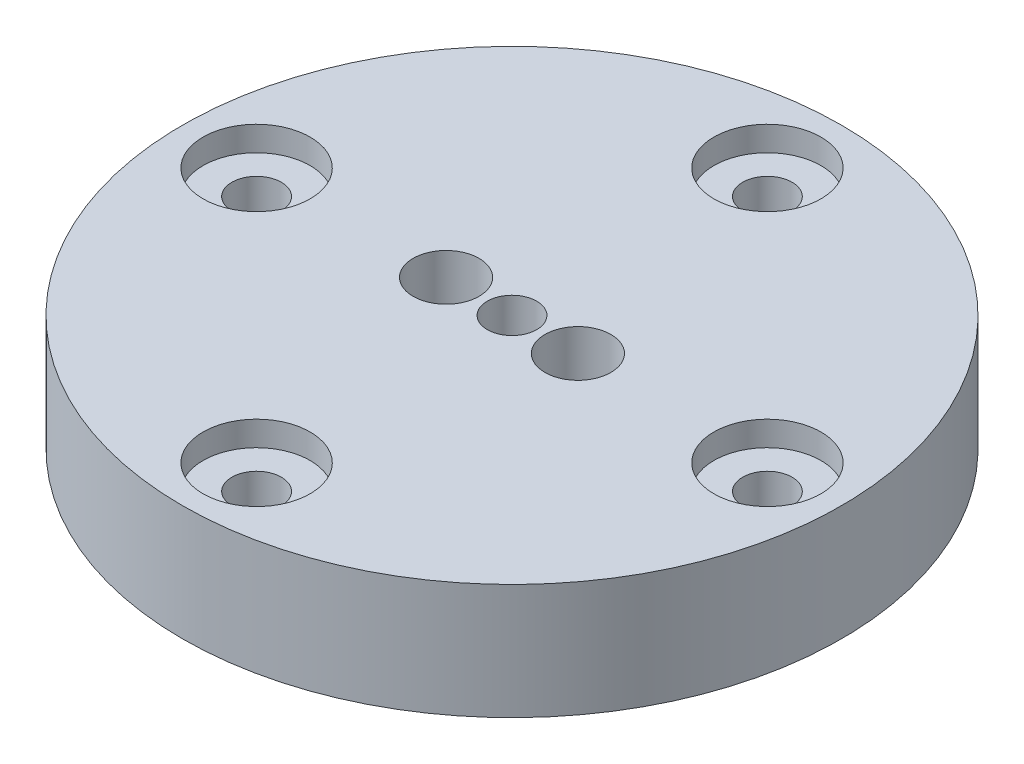
ISO-10303-21;
HEADER;
FILE_DESCRIPTION(('STEP AP214'),'2;1');
FILE_NAME('part.step','',(''),(''),'','','');
FILE_SCHEMA(('AUTOMOTIVE_DESIGN { 1 0 10303 214 1 1 1 1 }'));
ENDSEC;
DATA;
#1=APPLICATION_CONTEXT('core data for automotive mechanical design processes');
#2=APPLICATION_PROTOCOL_DEFINITION('international standard','automotive_design',2000,#1);
#3=PRODUCT_CONTEXT('',#1,'mechanical');
#4=PRODUCT('Part','Part','',(#3));
#5=PRODUCT_RELATED_PRODUCT_CATEGORY('part','',(#4));
#6=PRODUCT_DEFINITION_FORMATION('','',#4);
#7=PRODUCT_DEFINITION_CONTEXT('part definition',#1,'design');
#8=PRODUCT_DEFINITION('design','',#6,#7);
#9=PRODUCT_DEFINITION_SHAPE('','',#8);
#10=(LENGTH_UNIT() NAMED_UNIT(*) SI_UNIT(.MILLI.,.METRE.));
#11=(NAMED_UNIT(*) PLANE_ANGLE_UNIT() SI_UNIT($,.RADIAN.));
#12=(NAMED_UNIT(*) SI_UNIT($,.STERADIAN.) SOLID_ANGLE_UNIT());
#13=UNCERTAINTY_MEASURE_WITH_UNIT(LENGTH_MEASURE(1.E-05),#10,'distance_accuracy_value','');
#14=(GEOMETRIC_REPRESENTATION_CONTEXT(3) GLOBAL_UNCERTAINTY_ASSIGNED_CONTEXT((#13)) GLOBAL_UNIT_ASSIGNED_CONTEXT((#10,
#11,#12)) REPRESENTATION_CONTEXT('',''));
#15=CARTESIAN_POINT('',(0.,0.,0.));
#16=DIRECTION('',(0.,0.,1.));
#17=DIRECTION('',(1.,0.,0.));
#18=AXIS2_PLACEMENT_3D('',#15,#16,#17);
#19=CARTESIAN_POINT('',(0.,7.,-15.5));
#20=DIRECTION('',(0.,-1.,0.));
#21=DIRECTION('',(0.,0.,-1.));
#22=AXIS2_PLACEMENT_3D('',#19,#20,#21);
#23=CYLINDRICAL_SURFACE('',#22,1.5);
#24=CARTESIAN_POINT('',(0.,0.,-15.5));
#25=DIRECTION('',(0.,1.,0.));
#26=DIRECTION('',(0.,0.,1.));
#27=AXIS2_PLACEMENT_3D('',#24,#25,#26);
#28=CIRCLE('',#27,1.5);
#29=CARTESIAN_POINT('',(0.,0.,-14.));
#30=VERTEX_POINT('',#29);
#31=EDGE_CURVE('E46',#30,#30,#28,.T.);
#32=ORIENTED_EDGE('',*,*,#31,.F.);
#33=EDGE_LOOP('',(#32));
#34=FACE_BOUND('',#33,.T.);
#35=CARTESIAN_POINT('',(0.,5.5,-15.5));
#36=DIRECTION('',(0.,1.,0.));
#37=DIRECTION('',(0.,0.,1.));
#38=AXIS2_PLACEMENT_3D('',#35,#36,#37);
#39=CIRCLE('',#38,1.5);
#40=CARTESIAN_POINT('',(0.,5.5,-14.));
#41=VERTEX_POINT('',#40);
#42=EDGE_CURVE('E37',#41,#41,#39,.T.);
#43=ORIENTED_EDGE('',*,*,#42,.T.);
#44=EDGE_LOOP('',(#43));
#45=FACE_BOUND('',#44,.T.);
#46=ADVANCED_FACE('F33',(#34,#45),#23,.F.);
#47=CARTESIAN_POINT('',(15.5000000000004,7.,-4.37689192363245E-13));
#48=DIRECTION('',(0.,-1.,0.));
#49=DIRECTION('',(0.,0.,-1.));
#50=AXIS2_PLACEMENT_3D('',#47,#48,#49);
#51=CYLINDRICAL_SURFACE('',#50,1.50000000000034);
#52=CARTESIAN_POINT('',(15.5000000000004,0.,-4.37689192363245E-13));
#53=DIRECTION('',(0.,1.,0.));
#54=DIRECTION('',(0.,0.,1.));
#55=AXIS2_PLACEMENT_3D('',#52,#53,#54);
#56=CIRCLE('',#55,1.50000000000034);
#57=CARTESIAN_POINT('',(15.5000000000004,0.,1.49999999999991));
#58=VERTEX_POINT('',#57);
#59=EDGE_CURVE('E91',#58,#58,#56,.T.);
#60=ORIENTED_EDGE('',*,*,#59,.F.);
#61=EDGE_LOOP('',(#60));
#62=FACE_BOUND('',#61,.T.);
#63=CARTESIAN_POINT('',(15.5000000000004,5.5,-4.37689192363245E-13));
#64=DIRECTION('',(0.,1.,0.));
#65=DIRECTION('',(0.,0.,1.));
#66=AXIS2_PLACEMENT_3D('',#63,#64,#65);
#67=CIRCLE('',#66,1.50000000000034);
#68=CARTESIAN_POINT('',(15.5000000000004,5.5,1.49999999999991));
#69=VERTEX_POINT('',#68);
#70=EDGE_CURVE('E57',#69,#69,#67,.T.);
#71=ORIENTED_EDGE('',*,*,#70,.T.);
#72=EDGE_LOOP('',(#71));
#73=FACE_BOUND('',#72,.T.);
#74=ADVANCED_FACE('F101',(#62,#73),#51,.F.);
#75=CARTESIAN_POINT('',(8.75378384726489E-13,7.,15.5));
#76=DIRECTION('',(0.,-1.,0.));
#77=DIRECTION('',(0.,0.,-1.));
#78=AXIS2_PLACEMENT_3D('',#75,#76,#77);
#79=CYLINDRICAL_SURFACE('',#78,1.50000000000094);
#80=CARTESIAN_POINT('',(8.75378384726489E-13,0.,15.5));
#81=DIRECTION('',(0.,1.,0.));
#82=DIRECTION('',(0.,0.,1.));
#83=AXIS2_PLACEMENT_3D('',#80,#81,#82);
#84=CIRCLE('',#83,1.50000000000094);
#85=CARTESIAN_POINT('',(8.75378384726489E-13,0.,17.0000000000009));
#86=VERTEX_POINT('',#85);
#87=EDGE_CURVE('E89',#86,#86,#84,.T.);
#88=ORIENTED_EDGE('',*,*,#87,.F.);
#89=EDGE_LOOP('',(#88));
#90=FACE_BOUND('',#89,.T.);
#91=CARTESIAN_POINT('',(8.75378384726489E-13,5.5,15.5));
#92=DIRECTION('',(0.,1.,0.));
#93=DIRECTION('',(0.,0.,1.));
#94=AXIS2_PLACEMENT_3D('',#91,#92,#93);
#95=CIRCLE('',#94,1.50000000000094);
#96=CARTESIAN_POINT('',(8.75378384726489E-13,5.5,17.0000000000009));
#97=VERTEX_POINT('',#96);
#98=EDGE_CURVE('E54',#97,#97,#95,.T.);
#99=ORIENTED_EDGE('',*,*,#98,.T.);
#100=EDGE_LOOP('',(#99));
#101=FACE_BOUND('',#100,.T.);
#102=ADVANCED_FACE('F106',(#90,#101),#79,.F.);
#103=CARTESIAN_POINT('',(-15.4999999999996,7.,4.39587394901923E-13));
#104=DIRECTION('',(0.,-1.,0.));
#105=DIRECTION('',(0.,0.,-1.));
#106=AXIS2_PLACEMENT_3D('',#103,#104,#105);
#107=CYLINDRICAL_SURFACE('',#106,1.5000000000007);
#108=CARTESIAN_POINT('',(-15.4999999999996,0.,4.39587394901923E-13));
#109=DIRECTION('',(0.,1.,0.));
#110=DIRECTION('',(0.,0.,1.));
#111=AXIS2_PLACEMENT_3D('',#108,#109,#110);
#112=CIRCLE('',#111,1.5000000000007);
#113=CARTESIAN_POINT('',(-15.4999999999996,0.,1.50000000000114));
#114=VERTEX_POINT('',#113);
#115=EDGE_CURVE('E84',#114,#114,#112,.T.);
#116=ORIENTED_EDGE('',*,*,#115,.F.);
#117=EDGE_LOOP('',(#116));
#118=FACE_BOUND('',#117,.T.);
#119=CARTESIAN_POINT('',(-15.4999999999996,5.5,4.39587394901923E-13));
#120=DIRECTION('',(0.,1.,0.));
#121=DIRECTION('',(0.,0.,1.));
#122=AXIS2_PLACEMENT_3D('',#119,#120,#121);
#123=CIRCLE('',#122,1.5000000000007);
#124=CARTESIAN_POINT('',(-15.4999999999996,5.5,1.50000000000114));
#125=VERTEX_POINT('',#124);
#126=EDGE_CURVE('E51',#125,#125,#123,.T.);
#127=ORIENTED_EDGE('',*,*,#126,.T.);
#128=EDGE_LOOP('',(#127));
#129=FACE_BOUND('',#128,.T.);
#130=ADVANCED_FACE('F113',(#118,#129),#107,.F.);
#131=CARTESIAN_POINT('',(0.,7.,0.));
#132=DIRECTION('',(0.,1.,0.));
#133=DIRECTION('',(0.,0.,1.));
#134=AXIS2_PLACEMENT_3D('',#131,#132,#133);
#135=PLANE('',#134);
#136=CARTESIAN_POINT('',(0.,7.,-15.5000000000004));
#137=DIRECTION('',(0.,1.,0.));
#138=DIRECTION('',(0.,0.,1.));
#139=AXIS2_PLACEMENT_3D('',#136,#137,#138);
#140=CIRCLE('',#139,3.25);
#141=CARTESIAN_POINT('',(0.,7.,-12.2500000000004));
#142=VERTEX_POINT('',#141);
#143=EDGE_CURVE('E217',#142,#142,#140,.T.);
#144=ORIENTED_EDGE('',*,*,#143,.F.);
#145=EDGE_LOOP('',(#144));
#146=FACE_BOUND('',#145,.T.);
#147=CARTESIAN_POINT('',(15.5000000000009,7.,-4.37689192363257E-13));
#148=DIRECTION('',(0.,1.,0.));
#149=DIRECTION('',(0.,0.,1.));
#150=AXIS2_PLACEMENT_3D('',#147,#148,#149);
#151=CIRCLE('',#150,3.25000000000034);
#152=CARTESIAN_POINT('',(15.5000000000009,7.,3.2499999999999));
#153=VERTEX_POINT('',#152);
#154=EDGE_CURVE('E159',#153,#153,#151,.T.);
#155=ORIENTED_EDGE('',*,*,#154,.F.);
#156=EDGE_LOOP('',(#155));
#157=FACE_BOUND('',#156,.T.);
#158=CARTESIAN_POINT('',(8.75378384726514E-13,7.,15.5000000000004));
#159=DIRECTION('',(0.,1.,0.));
#160=DIRECTION('',(0.,0.,1.));
#161=AXIS2_PLACEMENT_3D('',#158,#159,#160);
#162=CIRCLE('',#161,3.25000000000094);
#163=CARTESIAN_POINT('',(8.75378384726514E-13,7.,18.7500000000014));
#164=VERTEX_POINT('',#163);
#165=EDGE_CURVE('E160',#164,#164,#162,.T.);
#166=ORIENTED_EDGE('',*,*,#165,.F.);
#167=EDGE_LOOP('',(#166));
#168=FACE_BOUND('',#167,.T.);
#169=CARTESIAN_POINT('',(-15.5,7.,4.39587394901935E-13));
#170=DIRECTION('',(0.,1.,0.));
#171=DIRECTION('',(0.,0.,1.));
#172=AXIS2_PLACEMENT_3D('',#169,#170,#171);
#173=CIRCLE('',#172,3.2500000000007);
#174=CARTESIAN_POINT('',(-15.5,7.,3.25000000000114));
#175=VERTEX_POINT('',#174);
#176=EDGE_CURVE('E171',#175,#175,#173,.T.);
#177=ORIENTED_EDGE('',*,*,#176,.F.);
#178=EDGE_LOOP('',(#177));
#179=FACE_BOUND('',#178,.T.);
#180=CARTESIAN_POINT('',(4.,7.,0.));
#181=DIRECTION('',(0.,1.,0.));
#182=DIRECTION('',(0.,0.,1.));
#183=AXIS2_PLACEMENT_3D('',#180,#181,#182);
#184=CIRCLE('',#183,2.);
#185=CARTESIAN_POINT('',(4.,7.,2.));
#186=VERTEX_POINT('',#185);
#187=EDGE_CURVE('E75',#186,#186,#184,.T.);
#188=ORIENTED_EDGE('',*,*,#187,.F.);
#189=EDGE_LOOP('',(#188));
#190=FACE_BOUND('',#189,.T.);
#191=CARTESIAN_POINT('',(0.,7.,0.));
#192=DIRECTION('',(0.,1.,0.));
#193=DIRECTION('',(0.,0.,1.));
#194=AXIS2_PLACEMENT_3D('',#191,#192,#193);
#195=CIRCLE('',#194,20.);
#196=CARTESIAN_POINT('',(0.,7.,20.));
#197=VERTEX_POINT('',#196);
#198=EDGE_CURVE('E10',#197,#197,#195,.T.);
#199=ORIENTED_EDGE('',*,*,#198,.T.);
#200=EDGE_LOOP('',(#199));
#201=FACE_BOUND('',#200,.T.);
#202=CARTESIAN_POINT('',(-4.,7.,0.));
#203=DIRECTION('',(0.,1.,0.));
#204=DIRECTION('',(0.,0.,1.));
#205=AXIS2_PLACEMENT_3D('',#202,#203,#204);
#206=CIRCLE('',#205,2.);
#207=CARTESIAN_POINT('',(-4.,7.,2.));
#208=VERTEX_POINT('',#207);
#209=EDGE_CURVE('E81',#208,#208,#206,.T.);
#210=ORIENTED_EDGE('',*,*,#209,.F.);
#211=EDGE_LOOP('',(#210));
#212=FACE_BOUND('',#211,.T.);
#213=CARTESIAN_POINT('',(0.,7.,0.));
#214=DIRECTION('',(0.,1.,0.));
#215=DIRECTION('',(0.,0.,1.));
#216=AXIS2_PLACEMENT_3D('',#213,#214,#215);
#217=CIRCLE('',#216,1.5);
#218=CARTESIAN_POINT('',(0.,7.,1.5));
#219=VERTEX_POINT('',#218);
#220=EDGE_CURVE('E66',#219,#219,#217,.T.);
#221=ORIENTED_EDGE('',*,*,#220,.F.);
#222=EDGE_LOOP('',(#221));
#223=FACE_BOUND('',#222,.T.);
#224=ADVANCED_FACE('F111',(#146,#157,#168,#179,#190,#201,#212,#223),#135,.T.);
#225=CARTESIAN_POINT('',(0.,0.,0.));
#226=DIRECTION('',(0.,1.,0.));
#227=DIRECTION('',(0.,0.,1.));
#228=AXIS2_PLACEMENT_3D('',#225,#226,#227);
#229=PLANE('',#228);
#230=CARTESIAN_POINT('',(0.,0.,0.));
#231=DIRECTION('',(0.,1.,0.));
#232=DIRECTION('',(0.,0.,1.));
#233=AXIS2_PLACEMENT_3D('',#230,#231,#232);
#234=CIRCLE('',#233,20.);
#235=CARTESIAN_POINT('',(0.,0.,20.));
#236=VERTEX_POINT('',#235);
#237=EDGE_CURVE('E41',#236,#236,#234,.T.);
#238=ORIENTED_EDGE('',*,*,#237,.F.);
#239=EDGE_LOOP('',(#238));
#240=FACE_BOUND('',#239,.T.);
#241=ORIENTED_EDGE('',*,*,#31,.T.);
#242=EDGE_LOOP('',(#241));
#243=FACE_BOUND('',#242,.T.);
#244=ORIENTED_EDGE('',*,*,#59,.T.);
#245=EDGE_LOOP('',(#244));
#246=FACE_BOUND('',#245,.T.);
#247=ORIENTED_EDGE('',*,*,#87,.T.);
#248=EDGE_LOOP('',(#247));
#249=FACE_BOUND('',#248,.T.);
#250=ORIENTED_EDGE('',*,*,#115,.T.);
#251=EDGE_LOOP('',(#250));
#252=FACE_BOUND('',#251,.T.);
#253=CARTESIAN_POINT('',(-4.,0.,0.));
#254=DIRECTION('',(0.,1.,0.));
#255=DIRECTION('',(0.,0.,1.));
#256=AXIS2_PLACEMENT_3D('',#253,#254,#255);
#257=CIRCLE('',#256,2.);
#258=CARTESIAN_POINT('',(-4.,0.,2.));
#259=VERTEX_POINT('',#258);
#260=EDGE_CURVE('E78',#259,#259,#257,.T.);
#261=ORIENTED_EDGE('',*,*,#260,.T.);
#262=EDGE_LOOP('',(#261));
#263=FACE_BOUND('',#262,.T.);
#264=CARTESIAN_POINT('',(4.,0.,0.));
#265=DIRECTION('',(0.,1.,0.));
#266=DIRECTION('',(0.,0.,1.));
#267=AXIS2_PLACEMENT_3D('',#264,#265,#266);
#268=CIRCLE('',#267,2.);
#269=CARTESIAN_POINT('',(4.,0.,2.));
#270=VERTEX_POINT('',#269);
#271=EDGE_CURVE('E71',#270,#270,#268,.T.);
#272=ORIENTED_EDGE('',*,*,#271,.T.);
#273=EDGE_LOOP('',(#272));
#274=FACE_BOUND('',#273,.T.);
#275=CARTESIAN_POINT('',(0.,0.,0.));
#276=DIRECTION('',(0.,1.,0.));
#277=DIRECTION('',(0.,0.,1.));
#278=AXIS2_PLACEMENT_3D('',#275,#276,#277);
#279=CIRCLE('',#278,1.5);
#280=CARTESIAN_POINT('',(0.,0.,1.5));
#281=VERTEX_POINT('',#280);
#282=EDGE_CURVE('E62',#281,#281,#279,.T.);
#283=ORIENTED_EDGE('',*,*,#282,.T.);
#284=EDGE_LOOP('',(#283));
#285=FACE_BOUND('',#284,.T.);
#286=ADVANCED_FACE('F98',(#240,#243,#246,#249,#252,#263,#274,#285),#229,.F.);
#287=CARTESIAN_POINT('',(0.,7.,0.));
#288=DIRECTION('',(0.,-1.,0.));
#289=DIRECTION('',(0.,0.,-1.));
#290=AXIS2_PLACEMENT_3D('',#287,#288,#289);
#291=CYLINDRICAL_SURFACE('',#290,20.);
#292=ORIENTED_EDGE('',*,*,#198,.F.);
#293=EDGE_LOOP('',(#292));
#294=FACE_BOUND('',#293,.T.);
#295=ORIENTED_EDGE('',*,*,#237,.T.);
#296=EDGE_LOOP('',(#295));
#297=FACE_BOUND('',#296,.T.);
#298=ADVANCED_FACE('F35',(#294,#297),#291,.T.);
#299=CARTESIAN_POINT('',(-4.,7.,0.));
#300=DIRECTION('',(0.,-1.,0.));
#301=DIRECTION('',(0.,0.,-1.));
#302=AXIS2_PLACEMENT_3D('',#299,#300,#301);
#303=CYLINDRICAL_SURFACE('',#302,2.);
#304=ORIENTED_EDGE('',*,*,#209,.T.);
#305=EDGE_LOOP('',(#304));
#306=FACE_BOUND('',#305,.T.);
#307=ORIENTED_EDGE('',*,*,#260,.F.);
#308=EDGE_LOOP('',(#307));
#309=FACE_BOUND('',#308,.T.);
#310=ADVANCED_FACE('F120',(#306,#309),#303,.F.);
#311=CARTESIAN_POINT('',(4.,7.,0.));
#312=DIRECTION('',(0.,-1.,0.));
#313=DIRECTION('',(0.,0.,-1.));
#314=AXIS2_PLACEMENT_3D('',#311,#312,#313);
#315=CYLINDRICAL_SURFACE('',#314,2.);
#316=ORIENTED_EDGE('',*,*,#187,.T.);
#317=EDGE_LOOP('',(#316));
#318=FACE_BOUND('',#317,.T.);
#319=ORIENTED_EDGE('',*,*,#271,.F.);
#320=EDGE_LOOP('',(#319));
#321=FACE_BOUND('',#320,.T.);
#322=ADVANCED_FACE('F127',(#318,#321),#315,.F.);
#323=CARTESIAN_POINT('',(0.,7.,0.));
#324=DIRECTION('',(0.,-1.,0.));
#325=DIRECTION('',(0.,0.,-1.));
#326=AXIS2_PLACEMENT_3D('',#323,#324,#325);
#327=CYLINDRICAL_SURFACE('',#326,1.5);
#328=ORIENTED_EDGE('',*,*,#220,.T.);
#329=EDGE_LOOP('',(#328));
#330=FACE_BOUND('',#329,.T.);
#331=ORIENTED_EDGE('',*,*,#282,.F.);
#332=EDGE_LOOP('',(#331));
#333=FACE_BOUND('',#332,.T.);
#334=ADVANCED_FACE('F133',(#330,#333),#327,.F.);
#335=CARTESIAN_POINT('',(-15.5,5.5,4.39587394901935E-13));
#336=DIRECTION('',(0.,1.,0.));
#337=DIRECTION('',(0.,0.,1.));
#338=AXIS2_PLACEMENT_3D('',#335,#336,#337);
#339=CYLINDRICAL_SURFACE('',#338,3.2500000000007);
#340=CARTESIAN_POINT('',(-15.5,5.5,4.39587394901935E-13));
#341=DIRECTION('',(0.,1.,0.));
#342=DIRECTION('',(0.,0.,1.));
#343=AXIS2_PLACEMENT_3D('',#340,#341,#342);
#344=CIRCLE('',#343,3.2500000000007);
#345=CARTESIAN_POINT('',(-15.5,5.5,3.25000000000114));
#346=VERTEX_POINT('',#345);
#347=EDGE_CURVE('E166',#346,#346,#344,.T.);
#348=ORIENTED_EDGE('',*,*,#347,.F.);
#349=EDGE_LOOP('',(#348));
#350=FACE_BOUND('',#349,.T.);
#351=ORIENTED_EDGE('',*,*,#176,.T.);
#352=EDGE_LOOP('',(#351));
#353=FACE_BOUND('',#352,.T.);
#354=ADVANCED_FACE('F175',(#350,#353),#339,.F.);
#355=CARTESIAN_POINT('',(-15.5,5.5,4.39587394901935E-13));
#356=DIRECTION('',(0.,1.,0.));
#357=DIRECTION('',(0.,0.,1.));
#358=AXIS2_PLACEMENT_3D('',#355,#356,#357);
#359=PLANE('',#358);
#360=ORIENTED_EDGE('',*,*,#126,.F.);
#361=EDGE_LOOP('',(#360));
#362=FACE_BOUND('',#361,.T.);
#363=ORIENTED_EDGE('',*,*,#347,.T.);
#364=EDGE_LOOP('',(#363));
#365=FACE_BOUND('',#364,.T.);
#366=ADVANCED_FACE('F189',(#362,#365),#359,.T.);
#367=CARTESIAN_POINT('',(8.75378384726514E-13,5.5,15.5000000000004));
#368=DIRECTION('',(0.,1.,0.));
#369=DIRECTION('',(0.,0.,1.));
#370=AXIS2_PLACEMENT_3D('',#367,#368,#369);
#371=CYLINDRICAL_SURFACE('',#370,3.25000000000094);
#372=CARTESIAN_POINT('',(8.75378384726514E-13,5.5,15.5000000000004));
#373=DIRECTION('',(0.,1.,0.));
#374=DIRECTION('',(0.,0.,1.));
#375=AXIS2_PLACEMENT_3D('',#372,#373,#374);
#376=CIRCLE('',#375,3.25000000000094);
#377=CARTESIAN_POINT('',(8.75378384726514E-13,5.5,18.7500000000014));
#378=VERTEX_POINT('',#377);
#379=EDGE_CURVE('E157',#378,#378,#376,.T.);
#380=ORIENTED_EDGE('',*,*,#379,.F.);
#381=EDGE_LOOP('',(#380));
#382=FACE_BOUND('',#381,.T.);
#383=ORIENTED_EDGE('',*,*,#165,.T.);
#384=EDGE_LOOP('',(#383));
#385=FACE_BOUND('',#384,.T.);
#386=ADVANCED_FACE('F153',(#382,#385),#371,.F.);
#387=CARTESIAN_POINT('',(8.75378384726514E-13,5.5,15.5000000000004));
#388=DIRECTION('',(0.,1.,0.));
#389=DIRECTION('',(0.,0.,1.));
#390=AXIS2_PLACEMENT_3D('',#387,#388,#389);
#391=PLANE('',#390);
#392=ORIENTED_EDGE('',*,*,#98,.F.);
#393=EDGE_LOOP('',(#392));
#394=FACE_BOUND('',#393,.T.);
#395=ORIENTED_EDGE('',*,*,#379,.T.);
#396=EDGE_LOOP('',(#395));
#397=FACE_BOUND('',#396,.T.);
#398=ADVANCED_FACE('F149',(#394,#397),#391,.T.);
#399=CARTESIAN_POINT('',(15.5000000000009,5.5,-4.37689192363257E-13));
#400=DIRECTION('',(0.,1.,0.));
#401=DIRECTION('',(0.,0.,1.));
#402=AXIS2_PLACEMENT_3D('',#399,#400,#401);
#403=CYLINDRICAL_SURFACE('',#402,3.25000000000034);
#404=CARTESIAN_POINT('',(15.5000000000009,5.5,-4.37689192363257E-13));
#405=DIRECTION('',(0.,1.,0.));
#406=DIRECTION('',(0.,0.,1.));
#407=AXIS2_PLACEMENT_3D('',#404,#405,#406);
#408=CIRCLE('',#407,3.25000000000034);
#409=CARTESIAN_POINT('',(15.5000000000009,5.5,3.2499999999999));
#410=VERTEX_POINT('',#409);
#411=EDGE_CURVE('E163',#410,#410,#408,.T.);
#412=ORIENTED_EDGE('',*,*,#411,.F.);
#413=EDGE_LOOP('',(#412));
#414=FACE_BOUND('',#413,.T.);
#415=ORIENTED_EDGE('',*,*,#154,.T.);
#416=EDGE_LOOP('',(#415));
#417=FACE_BOUND('',#416,.T.);
#418=ADVANCED_FACE('F152',(#414,#417),#403,.F.);
#419=CARTESIAN_POINT('',(15.5000000000009,5.5,-4.37689192363257E-13));
#420=DIRECTION('',(0.,1.,0.));
#421=DIRECTION('',(0.,0.,1.));
#422=AXIS2_PLACEMENT_3D('',#419,#420,#421);
#423=PLANE('',#422);
#424=ORIENTED_EDGE('',*,*,#70,.F.);
#425=EDGE_LOOP('',(#424));
#426=FACE_BOUND('',#425,.T.);
#427=ORIENTED_EDGE('',*,*,#411,.T.);
#428=EDGE_LOOP('',(#427));
#429=FACE_BOUND('',#428,.T.);
#430=ADVANCED_FACE('F200',(#426,#429),#423,.T.);
#431=CARTESIAN_POINT('',(0.,5.5,-15.5000000000004));
#432=DIRECTION('',(0.,1.,0.));
#433=DIRECTION('',(0.,0.,1.));
#434=AXIS2_PLACEMENT_3D('',#431,#432,#433);
#435=CYLINDRICAL_SURFACE('',#434,3.25);
#436=CARTESIAN_POINT('',(0.,5.5,-15.5000000000004));
#437=DIRECTION('',(0.,1.,0.));
#438=DIRECTION('',(0.,0.,1.));
#439=AXIS2_PLACEMENT_3D('',#436,#437,#438);
#440=CIRCLE('',#439,3.25);
#441=CARTESIAN_POINT('',(0.,5.5,-12.2500000000004));
#442=VERTEX_POINT('',#441);
#443=EDGE_CURVE('E55',#442,#442,#440,.T.);
#444=ORIENTED_EDGE('',*,*,#443,.F.);
#445=EDGE_LOOP('',(#444));
#446=FACE_BOUND('',#445,.T.);
#447=ORIENTED_EDGE('',*,*,#143,.T.);
#448=EDGE_LOOP('',(#447));
#449=FACE_BOUND('',#448,.T.);
#450=ADVANCED_FACE('F204',(#446,#449),#435,.F.);
#451=CARTESIAN_POINT('',(0.,5.5,-15.5000000000004));
#452=DIRECTION('',(0.,1.,0.));
#453=DIRECTION('',(0.,0.,1.));
#454=AXIS2_PLACEMENT_3D('',#451,#452,#453);
#455=PLANE('',#454);
#456=ORIENTED_EDGE('',*,*,#42,.F.);
#457=EDGE_LOOP('',(#456));
#458=FACE_BOUND('',#457,.T.);
#459=ORIENTED_EDGE('',*,*,#443,.T.);
#460=EDGE_LOOP('',(#459));
#461=FACE_BOUND('',#460,.T.);
#462=ADVANCED_FACE('F208',(#458,#461),#455,.T.);
#463=CLOSED_SHELL('',(#46,#74,#102,#130,#224,#286,#298,#310,#322,#334,#354,#366,#386,#398,#418,
#430,#450,#462));
#464=MANIFOLD_SOLID_BREP('B2',#463);
#465=ADVANCED_BREP_SHAPE_REPRESENTATION('',(#18,#464),#14);
#466=SHAPE_DEFINITION_REPRESENTATION(#9,#465);
ENDSEC;
END-ISO-10303-21;
